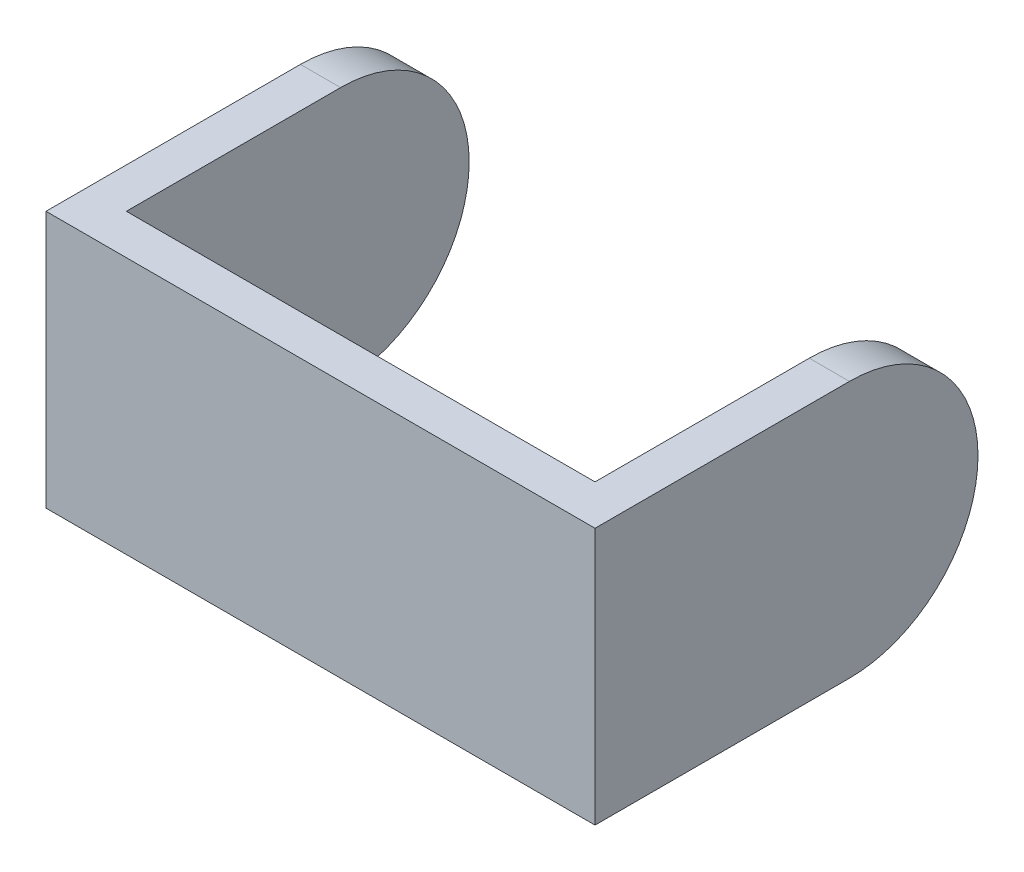
ISO-10303-21;
HEADER;
FILE_DESCRIPTION(('STEP AP214'),'2;1');
FILE_NAME('part.step','',(''),(''),'','','');
FILE_SCHEMA(('AUTOMOTIVE_DESIGN { 1 0 10303 214 1 1 1 1 }'));
ENDSEC;
DATA;
#1=APPLICATION_CONTEXT('core data for automotive mechanical design processes');
#2=APPLICATION_PROTOCOL_DEFINITION('international standard','automotive_design',2000,#1);
#3=PRODUCT_CONTEXT('',#1,'mechanical');
#4=PRODUCT('Part','Part','',(#3));
#5=PRODUCT_RELATED_PRODUCT_CATEGORY('part','',(#4));
#6=PRODUCT_DEFINITION_FORMATION('','',#4);
#7=PRODUCT_DEFINITION_CONTEXT('part definition',#1,'design');
#8=PRODUCT_DEFINITION('design','',#6,#7);
#9=PRODUCT_DEFINITION_SHAPE('','',#8);
#10=(LENGTH_UNIT() NAMED_UNIT(*) SI_UNIT(.MILLI.,.METRE.));
#11=(NAMED_UNIT(*) PLANE_ANGLE_UNIT() SI_UNIT($,.RADIAN.));
#12=(NAMED_UNIT(*) SI_UNIT($,.STERADIAN.) SOLID_ANGLE_UNIT());
#13=UNCERTAINTY_MEASURE_WITH_UNIT(LENGTH_MEASURE(1.E-05),#10,'distance_accuracy_value','');
#14=(GEOMETRIC_REPRESENTATION_CONTEXT(3) GLOBAL_UNCERTAINTY_ASSIGNED_CONTEXT((#13)) GLOBAL_UNIT_ASSIGNED_CONTEXT((#10,
#11,#12)) REPRESENTATION_CONTEXT('',''));
#15=CARTESIAN_POINT('',(0.,0.,0.));
#16=DIRECTION('',(0.,0.,1.));
#17=DIRECTION('',(1.,0.,0.));
#18=AXIS2_PLACEMENT_3D('',#15,#16,#17);
#19=CARTESIAN_POINT('',(3.,0.,0.));
#20=DIRECTION('',(-1.,0.,0.));
#21=DIRECTION('',(0.,0.,1.));
#22=AXIS2_PLACEMENT_3D('',#19,#20,#21);
#23=CYLINDRICAL_SURFACE('',#22,9.6);
#24=CARTESIAN_POINT('',(-35.,0.,0.));
#25=DIRECTION('',(1.,0.,0.));
#26=DIRECTION('',(0.,0.,-1.));
#27=AXIS2_PLACEMENT_3D('',#24,#25,#26);
#28=CIRCLE('',#27,9.6);
#29=CARTESIAN_POINT('',(-35.,-9.6,0.));
#30=VERTEX_POINT('',#29);
#31=CARTESIAN_POINT('',(-35.,9.6,0.));
#32=VERTEX_POINT('',#31);
#33=EDGE_CURVE('E104',#30,#32,#28,.T.);
#34=ORIENTED_EDGE('',*,*,#33,.F.);
#35=DIRECTION('',(-1.,0.,0.));
#36=VECTOR('',#35,1.);
#37=CARTESIAN_POINT('',(3.,-9.6,0.));
#38=LINE('',#37,#36);
#39=CARTESIAN_POINT('',(-38.,-9.6,0.));
#40=VERTEX_POINT('',#39);
#41=EDGE_CURVE('E140',#30,#40,#38,.T.);
#42=ORIENTED_EDGE('',*,*,#41,.T.);
#43=CARTESIAN_POINT('',(-38.,0.,0.));
#44=DIRECTION('',(1.,0.,0.));
#45=DIRECTION('',(0.,0.,-1.));
#46=AXIS2_PLACEMENT_3D('',#43,#44,#45);
#47=CIRCLE('',#46,9.6);
#48=CARTESIAN_POINT('',(-38.,9.6,0.));
#49=VERTEX_POINT('',#48);
#50=EDGE_CURVE('E126',#40,#49,#47,.T.);
#51=ORIENTED_EDGE('',*,*,#50,.T.);
#52=DIRECTION('',(-1.,0.,0.));
#53=VECTOR('',#52,1.);
#54=CARTESIAN_POINT('',(3.,9.6,0.));
#55=LINE('',#54,#53);
#56=EDGE_CURVE('E46',#32,#49,#55,.T.);
#57=ORIENTED_EDGE('',*,*,#56,.F.);
#58=EDGE_LOOP('',(#34,#42,#51,#57));
#59=FACE_BOUND('',#58,.T.);
#60=ADVANCED_FACE('F36',(#59),#23,.T.);
#61=CARTESIAN_POINT('',(3.,-9.6,0.));
#62=VERTEX_POINT('',#61);
#63=CARTESIAN_POINT('',(0.,-9.6,0.));
#64=VERTEX_POINT('',#63);
#65=EDGE_CURVE('E62',#62,#64,#38,.T.);
#66=ORIENTED_EDGE('',*,*,#65,.T.);
#67=CARTESIAN_POINT('',(0.,0.,0.));
#68=DIRECTION('',(1.,0.,0.));
#69=DIRECTION('',(0.,0.,-1.));
#70=AXIS2_PLACEMENT_3D('',#67,#68,#69);
#71=CIRCLE('',#70,9.6);
#72=CARTESIAN_POINT('',(0.,9.6,0.));
#73=VERTEX_POINT('',#72);
#74=EDGE_CURVE('E164',#64,#73,#71,.T.);
#75=ORIENTED_EDGE('',*,*,#74,.T.);
#76=CARTESIAN_POINT('',(3.,9.6,0.));
#77=VERTEX_POINT('',#76);
#78=EDGE_CURVE('E11',#77,#73,#55,.T.);
#79=ORIENTED_EDGE('',*,*,#78,.F.);
#80=CARTESIAN_POINT('',(3.,0.,0.));
#81=DIRECTION('',(1.,0.,0.));
#82=DIRECTION('',(0.,0.,-1.));
#83=AXIS2_PLACEMENT_3D('',#80,#81,#82);
#84=CIRCLE('',#83,9.6);
#85=EDGE_CURVE('E148',#62,#77,#84,.T.);
#86=ORIENTED_EDGE('',*,*,#85,.F.);
#87=EDGE_LOOP('',(#66,#75,#79,#86));
#88=FACE_BOUND('',#87,.T.);
#89=ADVANCED_FACE('F37',(#88),#23,.T.);
#90=CARTESIAN_POINT('',(3.,9.6,0.));
#91=DIRECTION('',(0.,-1.,0.));
#92=DIRECTION('',(0.,0.,-1.));
#93=AXIS2_PLACEMENT_3D('',#90,#91,#92);
#94=PLANE('',#93);
#95=ORIENTED_EDGE('',*,*,#78,.T.);
#96=DIRECTION('',(0.,0.,1.));
#97=VECTOR('',#96,1.);
#98=CARTESIAN_POINT('',(0.,9.6,0.));
#99=LINE('',#98,#97);
#100=CARTESIAN_POINT('',(0.,9.6,16.));
#101=VERTEX_POINT('',#100);
#102=EDGE_CURVE('E162',#73,#101,#99,.T.);
#103=ORIENTED_EDGE('',*,*,#102,.T.);
#104=DIRECTION('',(1.,0.,0.));
#105=VECTOR('',#104,1.);
#106=CARTESIAN_POINT('',(-35.,9.6,16.));
#107=LINE('',#106,#105);
#108=CARTESIAN_POINT('',(-35.,9.6,16.));
#109=VERTEX_POINT('',#108);
#110=EDGE_CURVE('E124',#109,#101,#107,.T.);
#111=ORIENTED_EDGE('',*,*,#110,.F.);
#112=DIRECTION('',(0.,0.,1.));
#113=VECTOR('',#112,1.);
#114=CARTESIAN_POINT('',(-35.,9.6,0.));
#115=LINE('',#114,#113);
#116=EDGE_CURVE('E108',#32,#109,#115,.T.);
#117=ORIENTED_EDGE('',*,*,#116,.F.);
#118=ORIENTED_EDGE('',*,*,#56,.T.);
#119=DIRECTION('',(0.,0.,1.));
#120=VECTOR('',#119,1.);
#121=CARTESIAN_POINT('',(-38.,9.59999999999997,0.));
#122=LINE('',#121,#120);
#123=CARTESIAN_POINT('',(-38.,9.6,19.));
#124=VERTEX_POINT('',#123);
#125=EDGE_CURVE('E149',#49,#124,#122,.T.);
#126=ORIENTED_EDGE('',*,*,#125,.T.);
#127=DIRECTION('',(-1.,0.,0.));
#128=VECTOR('',#127,1.);
#129=CARTESIAN_POINT('',(3.,9.6,19.));
#130=LINE('',#129,#128);
#131=CARTESIAN_POINT('',(3.,9.6,19.));
#132=VERTEX_POINT('',#131);
#133=EDGE_CURVE('E129',#132,#124,#130,.T.);
#134=ORIENTED_EDGE('',*,*,#133,.F.);
#135=DIRECTION('',(0.,0.,1.));
#136=VECTOR('',#135,1.);
#137=CARTESIAN_POINT('',(3.,9.6,0.));
#138=LINE('',#137,#136);
#139=EDGE_CURVE('E145',#77,#132,#138,.T.);
#140=ORIENTED_EDGE('',*,*,#139,.F.);
#141=EDGE_LOOP('',(#95,#103,#111,#117,#118,#126,#134,#140));
#142=FACE_BOUND('',#141,.T.);
#143=ADVANCED_FACE('F116',(#142),#94,.F.);
#144=CARTESIAN_POINT('',(3.,0.,19.));
#145=DIRECTION('',(0.,0.,1.));
#146=DIRECTION('',(1.,0.,0.));
#147=AXIS2_PLACEMENT_3D('',#144,#145,#146);
#148=PLANE('',#147);
#149=ORIENTED_EDGE('',*,*,#133,.T.);
#150=DIRECTION('',(0.,1.,0.));
#151=VECTOR('',#150,1.);
#152=CARTESIAN_POINT('',(-38.,0.,19.));
#153=LINE('',#152,#151);
#154=CARTESIAN_POINT('',(-38.,-9.6,19.));
#155=VERTEX_POINT('',#154);
#156=EDGE_CURVE('E152',#155,#124,#153,.T.);
#157=ORIENTED_EDGE('',*,*,#156,.F.);
#158=DIRECTION('',(-1.,0.,0.));
#159=VECTOR('',#158,1.);
#160=CARTESIAN_POINT('',(3.,-9.6,19.));
#161=LINE('',#160,#159);
#162=CARTESIAN_POINT('',(3.,-9.6,19.));
#163=VERTEX_POINT('',#162);
#164=EDGE_CURVE('E128',#163,#155,#161,.T.);
#165=ORIENTED_EDGE('',*,*,#164,.F.);
#166=DIRECTION('',(0.,1.,0.));
#167=VECTOR('',#166,1.);
#168=CARTESIAN_POINT('',(3.,0.,19.));
#169=LINE('',#168,#167);
#170=EDGE_CURVE('E142',#163,#132,#169,.T.);
#171=ORIENTED_EDGE('',*,*,#170,.T.);
#172=EDGE_LOOP('',(#149,#157,#165,#171));
#173=FACE_BOUND('',#172,.T.);
#174=ADVANCED_FACE('F173',(#173),#148,.T.);
#175=CARTESIAN_POINT('',(3.,-9.6,0.));
#176=DIRECTION('',(0.,-1.,0.));
#177=DIRECTION('',(0.,0.,-1.));
#178=AXIS2_PLACEMENT_3D('',#175,#176,#177);
#179=PLANE('',#178);
#180=DIRECTION('',(0.,0.,1.));
#181=VECTOR('',#180,1.);
#182=CARTESIAN_POINT('',(0.,-9.6,0.));
#183=LINE('',#182,#181);
#184=CARTESIAN_POINT('',(0.,-9.6,16.));
#185=VERTEX_POINT('',#184);
#186=EDGE_CURVE('E117',#64,#185,#183,.T.);
#187=ORIENTED_EDGE('',*,*,#186,.F.);
#188=ORIENTED_EDGE('',*,*,#65,.F.);
#189=DIRECTION('',(0.,0.,1.));
#190=VECTOR('',#189,1.);
#191=CARTESIAN_POINT('',(3.,-9.6,0.));
#192=LINE('',#191,#190);
#193=EDGE_CURVE('E136',#62,#163,#192,.T.);
#194=ORIENTED_EDGE('',*,*,#193,.T.);
#195=ORIENTED_EDGE('',*,*,#164,.T.);
#196=DIRECTION('',(0.,0.,1.));
#197=VECTOR('',#196,1.);
#198=CARTESIAN_POINT('',(-38.,-9.6,0.));
#199=LINE('',#198,#197);
#200=EDGE_CURVE('E151',#40,#155,#199,.T.);
#201=ORIENTED_EDGE('',*,*,#200,.F.);
#202=ORIENTED_EDGE('',*,*,#41,.F.);
#203=DIRECTION('',(0.,0.,1.));
#204=VECTOR('',#203,1.);
#205=CARTESIAN_POINT('',(-35.,-9.6,0.));
#206=LINE('',#205,#204);
#207=CARTESIAN_POINT('',(-35.,-9.6,16.));
#208=VERTEX_POINT('',#207);
#209=EDGE_CURVE('E115',#30,#208,#206,.T.);
#210=ORIENTED_EDGE('',*,*,#209,.T.);
#211=DIRECTION('',(1.,0.,0.));
#212=VECTOR('',#211,1.);
#213=CARTESIAN_POINT('',(-35.,-9.6,16.));
#214=LINE('',#213,#212);
#215=EDGE_CURVE('E160',#208,#185,#214,.T.);
#216=ORIENTED_EDGE('',*,*,#215,.T.);
#217=EDGE_LOOP('',(#187,#188,#194,#195,#201,#202,#210,#216));
#218=FACE_BOUND('',#217,.T.);
#219=ADVANCED_FACE('F168',(#218),#179,.T.);
#220=CARTESIAN_POINT('',(3.,0.,0.));
#221=DIRECTION('',(1.,0.,0.));
#222=DIRECTION('',(0.,0.,-1.));
#223=AXIS2_PLACEMENT_3D('',#220,#221,#222);
#224=PLANE('',#223);
#225=ORIENTED_EDGE('',*,*,#85,.T.);
#226=ORIENTED_EDGE('',*,*,#139,.T.);
#227=ORIENTED_EDGE('',*,*,#170,.F.);
#228=ORIENTED_EDGE('',*,*,#193,.F.);
#229=EDGE_LOOP('',(#225,#226,#227,#228));
#230=FACE_BOUND('',#229,.T.);
#231=ADVANCED_FACE('F179',(#230),#224,.T.);
#232=CARTESIAN_POINT('',(-38.,0.,0.));
#233=DIRECTION('',(1.,0.,0.));
#234=DIRECTION('',(0.,0.,-1.));
#235=AXIS2_PLACEMENT_3D('',#232,#233,#234);
#236=PLANE('',#235);
#237=ORIENTED_EDGE('',*,*,#156,.T.);
#238=ORIENTED_EDGE('',*,*,#125,.F.);
#239=ORIENTED_EDGE('',*,*,#50,.F.);
#240=ORIENTED_EDGE('',*,*,#200,.T.);
#241=EDGE_LOOP('',(#237,#238,#239,#240));
#242=FACE_BOUND('',#241,.T.);
#243=ADVANCED_FACE('F174',(#242),#236,.F.);
#244=CARTESIAN_POINT('',(-35.,0.,16.));
#245=DIRECTION('',(0.,0.,-1.));
#246=DIRECTION('',(-1.,0.,0.));
#247=AXIS2_PLACEMENT_3D('',#244,#245,#246);
#248=PLANE('',#247);
#249=DIRECTION('',(0.,1.,0.));
#250=VECTOR('',#249,1.);
#251=CARTESIAN_POINT('',(0.,0.,16.));
#252=LINE('',#251,#250);
#253=EDGE_CURVE('E52',#185,#101,#252,.T.);
#254=ORIENTED_EDGE('',*,*,#253,.F.);
#255=ORIENTED_EDGE('',*,*,#215,.F.);
#256=DIRECTION('',(0.,1.,0.));
#257=VECTOR('',#256,1.);
#258=CARTESIAN_POINT('',(-35.,0.,16.));
#259=LINE('',#258,#257);
#260=EDGE_CURVE('E123',#208,#109,#259,.T.);
#261=ORIENTED_EDGE('',*,*,#260,.T.);
#262=ORIENTED_EDGE('',*,*,#110,.T.);
#263=EDGE_LOOP('',(#254,#255,#261,#262));
#264=FACE_BOUND('',#263,.T.);
#265=ADVANCED_FACE('F166',(#264),#248,.T.);
#266=CARTESIAN_POINT('',(-35.,0.,0.));
#267=DIRECTION('',(1.,0.,0.));
#268=DIRECTION('',(0.,0.,-1.));
#269=AXIS2_PLACEMENT_3D('',#266,#267,#268);
#270=PLANE('',#269);
#271=ORIENTED_EDGE('',*,*,#33,.T.);
#272=ORIENTED_EDGE('',*,*,#116,.T.);
#273=ORIENTED_EDGE('',*,*,#260,.F.);
#274=ORIENTED_EDGE('',*,*,#209,.F.);
#275=EDGE_LOOP('',(#271,#272,#273,#274));
#276=FACE_BOUND('',#275,.T.);
#277=ADVANCED_FACE('F110',(#276),#270,.T.);
#278=CARTESIAN_POINT('',(0.,0.,0.));
#279=DIRECTION('',(1.,0.,0.));
#280=DIRECTION('',(0.,0.,-1.));
#281=AXIS2_PLACEMENT_3D('',#278,#279,#280);
#282=PLANE('',#281);
#283=ORIENTED_EDGE('',*,*,#74,.F.);
#284=ORIENTED_EDGE('',*,*,#186,.T.);
#285=ORIENTED_EDGE('',*,*,#253,.T.);
#286=ORIENTED_EDGE('',*,*,#102,.F.);
#287=EDGE_LOOP('',(#283,#284,#285,#286));
#288=FACE_BOUND('',#287,.T.);
#289=ADVANCED_FACE('F185',(#288),#282,.F.);
#290=CLOSED_SHELL('',(#60,#89,#143,#174,#219,#231,#243,#265,#277,#289));
#291=MANIFOLD_SOLID_BREP('B2',#290);
#292=ADVANCED_BREP_SHAPE_REPRESENTATION('',(#18,#291),#14);
#293=SHAPE_DEFINITION_REPRESENTATION(#9,#292);
ENDSEC;
END-ISO-10303-21;
